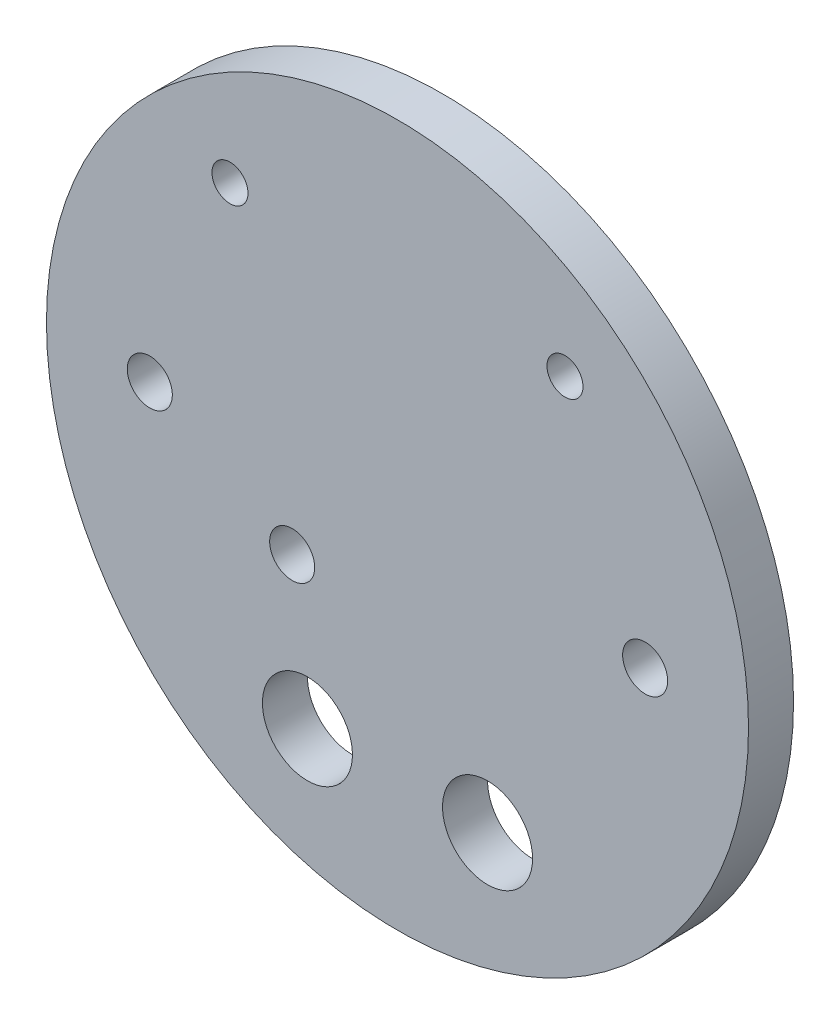
ISO-10303-21;
HEADER;
FILE_DESCRIPTION(('STEP AP214'),'2;1');
FILE_NAME('part.step','',(''),(''),'','','');
FILE_SCHEMA(('AUTOMOTIVE_DESIGN { 1 0 10303 214 1 1 1 1 }'));
ENDSEC;
DATA;
#1=APPLICATION_CONTEXT('core data for automotive mechanical design processes');
#2=APPLICATION_PROTOCOL_DEFINITION('international standard','automotive_design',2000,#1);
#3=PRODUCT_CONTEXT('',#1,'mechanical');
#4=PRODUCT('Part','Part','',(#3));
#5=PRODUCT_RELATED_PRODUCT_CATEGORY('part','',(#4));
#6=PRODUCT_DEFINITION_FORMATION('','',#4);
#7=PRODUCT_DEFINITION_CONTEXT('part definition',#1,'design');
#8=PRODUCT_DEFINITION('design','',#6,#7);
#9=PRODUCT_DEFINITION_SHAPE('','',#8);
#10=(LENGTH_UNIT() NAMED_UNIT(*) SI_UNIT(.MILLI.,.METRE.));
#11=(NAMED_UNIT(*) PLANE_ANGLE_UNIT() SI_UNIT($,.RADIAN.));
#12=(NAMED_UNIT(*) SI_UNIT($,.STERADIAN.) SOLID_ANGLE_UNIT());
#13=UNCERTAINTY_MEASURE_WITH_UNIT(LENGTH_MEASURE(1.E-05),#10,'distance_accuracy_value','');
#14=(GEOMETRIC_REPRESENTATION_CONTEXT(3) GLOBAL_UNCERTAINTY_ASSIGNED_CONTEXT((#13)) GLOBAL_UNIT_ASSIGNED_CONTEXT((#10,
#11,#12)) REPRESENTATION_CONTEXT('',''));
#15=CARTESIAN_POINT('',(0.,0.,0.));
#16=DIRECTION('',(0.,0.,1.));
#17=DIRECTION('',(1.,0.,0.));
#18=AXIS2_PLACEMENT_3D('',#15,#16,#17);
#19=CARTESIAN_POINT('',(0.,0.,3.175));
#20=DIRECTION('',(0.,0.,-1.));
#21=DIRECTION('',(-1.,0.,0.));
#22=AXIS2_PLACEMENT_3D('',#19,#20,#21);
#23=CYLINDRICAL_SURFACE('',#22,49.5046);
#24=CARTESIAN_POINT('',(0.,0.,0.));
#25=DIRECTION('',(0.,0.,1.));
#26=DIRECTION('',(1.,0.,0.));
#27=AXIS2_PLACEMENT_3D('',#24,#25,#26);
#28=CIRCLE('',#27,49.5046);
#29=CARTESIAN_POINT('',(49.5046,0.,0.));
#30=VERTEX_POINT('',#29);
#31=EDGE_CURVE('E10',#30,#30,#28,.T.);
#32=ORIENTED_EDGE('',*,*,#31,.T.);
#33=EDGE_LOOP('',(#32));
#34=FACE_BOUND('',#33,.T.);
#35=CARTESIAN_POINT('',(0.,0.,6.35));
#36=DIRECTION('',(0.,0.,1.));
#37=DIRECTION('',(1.,0.,0.));
#38=AXIS2_PLACEMENT_3D('',#35,#36,#37);
#39=CIRCLE('',#38,49.5046);
#40=CARTESIAN_POINT('',(49.5046,0.,6.35));
#41=VERTEX_POINT('',#40);
#42=EDGE_CURVE('E80',#41,#41,#39,.T.);
#43=ORIENTED_EDGE('',*,*,#42,.F.);
#44=EDGE_LOOP('',(#43));
#45=FACE_BOUND('',#44,.T.);
#46=ADVANCED_FACE('F35',(#34,#45),#23,.T.);
#47=CARTESIAN_POINT('',(0.,0.,0.));
#48=DIRECTION('',(0.,0.,1.));
#49=DIRECTION('',(1.,0.,0.));
#50=AXIS2_PLACEMENT_3D('',#47,#48,#49);
#51=PLANE('',#50);
#52=CARTESIAN_POINT('',(23.622,29.972,0.));
#53=DIRECTION('',(0.,0.,1.));
#54=DIRECTION('',(1.,0.,0.));
#55=AXIS2_PLACEMENT_3D('',#52,#53,#54);
#56=CIRCLE('',#55,2.54);
#57=CARTESIAN_POINT('',(26.162,29.972,0.));
#58=VERTEX_POINT('',#57);
#59=EDGE_CURVE('E79',#58,#58,#56,.T.);
#60=ORIENTED_EDGE('',*,*,#59,.T.);
#61=EDGE_LOOP('',(#60));
#62=FACE_BOUND('',#61,.T.);
#63=CARTESIAN_POINT('',(-23.622,29.972,0.));
#64=DIRECTION('',(0.,0.,1.));
#65=DIRECTION('',(1.,0.,0.));
#66=AXIS2_PLACEMENT_3D('',#63,#64,#65);
#67=CIRCLE('',#66,2.54);
#68=CARTESIAN_POINT('',(-21.082,29.972,0.));
#69=VERTEX_POINT('',#68);
#70=EDGE_CURVE('E68',#69,#69,#67,.T.);
#71=ORIENTED_EDGE('',*,*,#70,.T.);
#72=EDGE_LOOP('',(#71));
#73=FACE_BOUND('',#72,.T.);
#74=CARTESIAN_POINT('',(12.7,-31.2353524431853,0.));
#75=DIRECTION('',(0.,0.,1.));
#76=DIRECTION('',(1.,0.,0.));
#77=AXIS2_PLACEMENT_3D('',#74,#75,#76);
#78=CIRCLE('',#77,6.35);
#79=CARTESIAN_POINT('',(19.05,-31.2353524431853,0.));
#80=VERTEX_POINT('',#79);
#81=EDGE_CURVE('E50',#80,#80,#78,.T.);
#82=ORIENTED_EDGE('',*,*,#81,.T.);
#83=EDGE_LOOP('',(#82));
#84=FACE_BOUND('',#83,.T.);
#85=CARTESIAN_POINT('',(-34.925,0.,0.));
#86=DIRECTION('',(0.,0.,1.));
#87=DIRECTION('',(1.,0.,0.));
#88=AXIS2_PLACEMENT_3D('',#85,#86,#87);
#89=CIRCLE('',#88,3.17500000000001);
#90=CARTESIAN_POINT('',(-31.75,0.,0.));
#91=VERTEX_POINT('',#90);
#92=EDGE_CURVE('E55',#91,#91,#89,.T.);
#93=ORIENTED_EDGE('',*,*,#92,.T.);
#94=EDGE_LOOP('',(#93));
#95=FACE_BOUND('',#94,.T.);
#96=CARTESIAN_POINT('',(34.925,0.,0.));
#97=DIRECTION('',(0.,0.,1.));
#98=DIRECTION('',(1.,0.,0.));
#99=AXIS2_PLACEMENT_3D('',#96,#97,#98);
#100=CIRCLE('',#99,3.17500000000001);
#101=CARTESIAN_POINT('',(38.1,0.,0.));
#102=VERTEX_POINT('',#101);
#103=EDGE_CURVE('E56',#102,#102,#100,.T.);
#104=ORIENTED_EDGE('',*,*,#103,.T.);
#105=EDGE_LOOP('',(#104));
#106=FACE_BOUND('',#105,.T.);
#107=CARTESIAN_POINT('',(-14.8503900513557,-11.029456703896,0.));
#108=DIRECTION('',(0.,0.,1.));
#109=DIRECTION('',(1.,0.,0.));
#110=AXIS2_PLACEMENT_3D('',#107,#108,#109);
#111=CIRCLE('',#110,3.175);
#112=CARTESIAN_POINT('',(-11.6753900513557,-11.029456703896,0.));
#113=VERTEX_POINT('',#112);
#114=EDGE_CURVE('E67',#113,#113,#111,.T.);
#115=ORIENTED_EDGE('',*,*,#114,.T.);
#116=EDGE_LOOP('',(#115));
#117=FACE_BOUND('',#116,.T.);
#118=CARTESIAN_POINT('',(-12.7,-31.2353524431853,0.));
#119=DIRECTION('',(0.,0.,1.));
#120=DIRECTION('',(1.,0.,0.));
#121=AXIS2_PLACEMENT_3D('',#118,#119,#120);
#122=CIRCLE('',#121,6.35);
#123=CARTESIAN_POINT('',(-6.35,-31.2353524431853,0.));
#124=VERTEX_POINT('',#123);
#125=EDGE_CURVE('E41',#124,#124,#122,.T.);
#126=ORIENTED_EDGE('',*,*,#125,.T.);
#127=EDGE_LOOP('',(#126));
#128=FACE_BOUND('',#127,.T.);
#129=ORIENTED_EDGE('',*,*,#31,.F.);
#130=EDGE_LOOP('',(#129));
#131=FACE_BOUND('',#130,.T.);
#132=ADVANCED_FACE('F94',(#62,#73,#84,#95,#106,#117,#128,#131),#51,.F.);
#133=CARTESIAN_POINT('',(0.,0.,6.35));
#134=DIRECTION('',(0.,0.,1.));
#135=DIRECTION('',(1.,0.,0.));
#136=AXIS2_PLACEMENT_3D('',#133,#134,#135);
#137=PLANE('',#136);
#138=CARTESIAN_POINT('',(23.622,29.972,6.35));
#139=DIRECTION('',(0.,0.,1.));
#140=DIRECTION('',(1.,0.,0.));
#141=AXIS2_PLACEMENT_3D('',#138,#139,#140);
#142=CIRCLE('',#141,2.54);
#143=CARTESIAN_POINT('',(26.162,29.972,6.35));
#144=VERTEX_POINT('',#143);
#145=EDGE_CURVE('E76',#144,#144,#142,.T.);
#146=ORIENTED_EDGE('',*,*,#145,.F.);
#147=EDGE_LOOP('',(#146));
#148=FACE_BOUND('',#147,.T.);
#149=CARTESIAN_POINT('',(-23.622,29.972,6.35));
#150=DIRECTION('',(0.,0.,1.));
#151=DIRECTION('',(1.,0.,0.));
#152=AXIS2_PLACEMENT_3D('',#149,#150,#151);
#153=CIRCLE('',#152,2.54);
#154=CARTESIAN_POINT('',(-21.082,29.972,6.35));
#155=VERTEX_POINT('',#154);
#156=EDGE_CURVE('E83',#155,#155,#153,.T.);
#157=ORIENTED_EDGE('',*,*,#156,.F.);
#158=EDGE_LOOP('',(#157));
#159=FACE_BOUND('',#158,.T.);
#160=CARTESIAN_POINT('',(12.7,-31.2353524431853,6.35));
#161=DIRECTION('',(0.,0.,1.));
#162=DIRECTION('',(1.,0.,0.));
#163=AXIS2_PLACEMENT_3D('',#160,#161,#162);
#164=CIRCLE('',#163,6.35);
#165=CARTESIAN_POINT('',(19.05,-31.2353524431853,6.35));
#166=VERTEX_POINT('',#165);
#167=EDGE_CURVE('E59',#166,#166,#164,.T.);
#168=ORIENTED_EDGE('',*,*,#167,.F.);
#169=EDGE_LOOP('',(#168));
#170=FACE_BOUND('',#169,.T.);
#171=CARTESIAN_POINT('',(-34.925,0.,6.35));
#172=DIRECTION('',(0.,0.,1.));
#173=DIRECTION('',(1.,0.,0.));
#174=AXIS2_PLACEMENT_3D('',#171,#172,#173);
#175=CIRCLE('',#174,3.17500000000001);
#176=CARTESIAN_POINT('',(-31.75,0.,6.35));
#177=VERTEX_POINT('',#176);
#178=EDGE_CURVE('E52',#177,#177,#175,.T.);
#179=ORIENTED_EDGE('',*,*,#178,.F.);
#180=EDGE_LOOP('',(#179));
#181=FACE_BOUND('',#180,.T.);
#182=CARTESIAN_POINT('',(34.925,0.,6.35));
#183=DIRECTION('',(0.,0.,1.));
#184=DIRECTION('',(1.,0.,0.));
#185=AXIS2_PLACEMENT_3D('',#182,#183,#184);
#186=CIRCLE('',#185,3.17500000000001);
#187=CARTESIAN_POINT('',(38.1,0.,6.35));
#188=VERTEX_POINT('',#187);
#189=EDGE_CURVE('E71',#188,#188,#186,.T.);
#190=ORIENTED_EDGE('',*,*,#189,.F.);
#191=EDGE_LOOP('',(#190));
#192=FACE_BOUND('',#191,.T.);
#193=CARTESIAN_POINT('',(-14.8503900513557,-11.029456703896,6.35));
#194=DIRECTION('',(0.,0.,1.));
#195=DIRECTION('',(1.,0.,0.));
#196=AXIS2_PLACEMENT_3D('',#193,#194,#195);
#197=CIRCLE('',#196,3.175);
#198=CARTESIAN_POINT('',(-11.6753900513557,-11.029456703896,6.35));
#199=VERTEX_POINT('',#198);
#200=EDGE_CURVE('E64',#199,#199,#197,.T.);
#201=ORIENTED_EDGE('',*,*,#200,.F.);
#202=EDGE_LOOP('',(#201));
#203=FACE_BOUND('',#202,.T.);
#204=CARTESIAN_POINT('',(-12.7,-31.2353524431853,6.35));
#205=DIRECTION('',(0.,0.,1.));
#206=DIRECTION('',(1.,0.,0.));
#207=AXIS2_PLACEMENT_3D('',#204,#205,#206);
#208=CIRCLE('',#207,6.35);
#209=CARTESIAN_POINT('',(-6.35,-31.2353524431853,6.35));
#210=VERTEX_POINT('',#209);
#211=EDGE_CURVE('E45',#210,#210,#208,.T.);
#212=ORIENTED_EDGE('',*,*,#211,.F.);
#213=EDGE_LOOP('',(#212));
#214=FACE_BOUND('',#213,.T.);
#215=ORIENTED_EDGE('',*,*,#42,.T.);
#216=EDGE_LOOP('',(#215));
#217=FACE_BOUND('',#216,.T.);
#218=ADVANCED_FACE('F91',(#148,#159,#170,#181,#192,#203,#214,#217),#137,.T.);
#219=CARTESIAN_POINT('',(-12.7,-31.2353524431853,0.));
#220=DIRECTION('',(0.,0.,1.));
#221=DIRECTION('',(1.,0.,0.));
#222=AXIS2_PLACEMENT_3D('',#219,#220,#221);
#223=CYLINDRICAL_SURFACE('',#222,6.35);
#224=ORIENTED_EDGE('',*,*,#125,.F.);
#225=EDGE_LOOP('',(#224));
#226=FACE_BOUND('',#225,.T.);
#227=ORIENTED_EDGE('',*,*,#211,.T.);
#228=EDGE_LOOP('',(#227));
#229=FACE_BOUND('',#228,.T.);
#230=ADVANCED_FACE('F102',(#226,#229),#223,.F.);
#231=CARTESIAN_POINT('',(-14.8503900513557,-11.029456703896,0.));
#232=DIRECTION('',(0.,0.,1.));
#233=DIRECTION('',(1.,0.,0.));
#234=AXIS2_PLACEMENT_3D('',#231,#232,#233);
#235=CYLINDRICAL_SURFACE('',#234,3.175);
#236=ORIENTED_EDGE('',*,*,#114,.F.);
#237=EDGE_LOOP('',(#236));
#238=FACE_BOUND('',#237,.T.);
#239=ORIENTED_EDGE('',*,*,#200,.T.);
#240=EDGE_LOOP('',(#239));
#241=FACE_BOUND('',#240,.T.);
#242=ADVANCED_FACE('F109',(#238,#241),#235,.F.);
#243=CARTESIAN_POINT('',(34.925,0.,0.));
#244=DIRECTION('',(0.,0.,1.));
#245=DIRECTION('',(1.,0.,0.));
#246=AXIS2_PLACEMENT_3D('',#243,#244,#245);
#247=CYLINDRICAL_SURFACE('',#246,3.17500000000001);
#248=ORIENTED_EDGE('',*,*,#103,.F.);
#249=EDGE_LOOP('',(#248));
#250=FACE_BOUND('',#249,.T.);
#251=ORIENTED_EDGE('',*,*,#189,.T.);
#252=EDGE_LOOP('',(#251));
#253=FACE_BOUND('',#252,.T.);
#254=ADVANCED_FACE('F115',(#250,#253),#247,.F.);
#255=CARTESIAN_POINT('',(-34.925,0.,0.));
#256=DIRECTION('',(0.,0.,1.));
#257=DIRECTION('',(1.,0.,0.));
#258=AXIS2_PLACEMENT_3D('',#255,#256,#257);
#259=CYLINDRICAL_SURFACE('',#258,3.17500000000001);
#260=ORIENTED_EDGE('',*,*,#92,.F.);
#261=EDGE_LOOP('',(#260));
#262=FACE_BOUND('',#261,.T.);
#263=ORIENTED_EDGE('',*,*,#178,.T.);
#264=EDGE_LOOP('',(#263));
#265=FACE_BOUND('',#264,.T.);
#266=ADVANCED_FACE('F111',(#262,#265),#259,.F.);
#267=CARTESIAN_POINT('',(12.7,-31.2353524431853,0.));
#268=DIRECTION('',(0.,0.,1.));
#269=DIRECTION('',(1.,0.,0.));
#270=AXIS2_PLACEMENT_3D('',#267,#268,#269);
#271=CYLINDRICAL_SURFACE('',#270,6.35);
#272=ORIENTED_EDGE('',*,*,#81,.F.);
#273=EDGE_LOOP('',(#272));
#274=FACE_BOUND('',#273,.T.);
#275=ORIENTED_EDGE('',*,*,#167,.T.);
#276=EDGE_LOOP('',(#275));
#277=FACE_BOUND('',#276,.T.);
#278=ADVANCED_FACE('F114',(#274,#277),#271,.F.);
#279=CARTESIAN_POINT('',(-23.622,29.972,0.));
#280=DIRECTION('',(0.,0.,1.));
#281=DIRECTION('',(1.,0.,0.));
#282=AXIS2_PLACEMENT_3D('',#279,#280,#281);
#283=CYLINDRICAL_SURFACE('',#282,2.54);
#284=ORIENTED_EDGE('',*,*,#70,.F.);
#285=EDGE_LOOP('',(#284));
#286=FACE_BOUND('',#285,.T.);
#287=ORIENTED_EDGE('',*,*,#156,.T.);
#288=EDGE_LOOP('',(#287));
#289=FACE_BOUND('',#288,.T.);
#290=ADVANCED_FACE('F119',(#286,#289),#283,.F.);
#291=CARTESIAN_POINT('',(23.622,29.972,0.));
#292=DIRECTION('',(0.,0.,1.));
#293=DIRECTION('',(1.,0.,0.));
#294=AXIS2_PLACEMENT_3D('',#291,#292,#293);
#295=CYLINDRICAL_SURFACE('',#294,2.54);
#296=ORIENTED_EDGE('',*,*,#59,.F.);
#297=EDGE_LOOP('',(#296));
#298=FACE_BOUND('',#297,.T.);
#299=ORIENTED_EDGE('',*,*,#145,.T.);
#300=EDGE_LOOP('',(#299));
#301=FACE_BOUND('',#300,.T.);
#302=ADVANCED_FACE('F127',(#298,#301),#295,.F.);
#303=CLOSED_SHELL('',(#46,#132,#218,#230,#242,#254,#266,#278,#290,#302));
#304=MANIFOLD_SOLID_BREP('B2',#303);
#305=ADVANCED_BREP_SHAPE_REPRESENTATION('',(#18,#304),#14);
#306=SHAPE_DEFINITION_REPRESENTATION(#9,#305);
ENDSEC;
END-ISO-10303-21;
